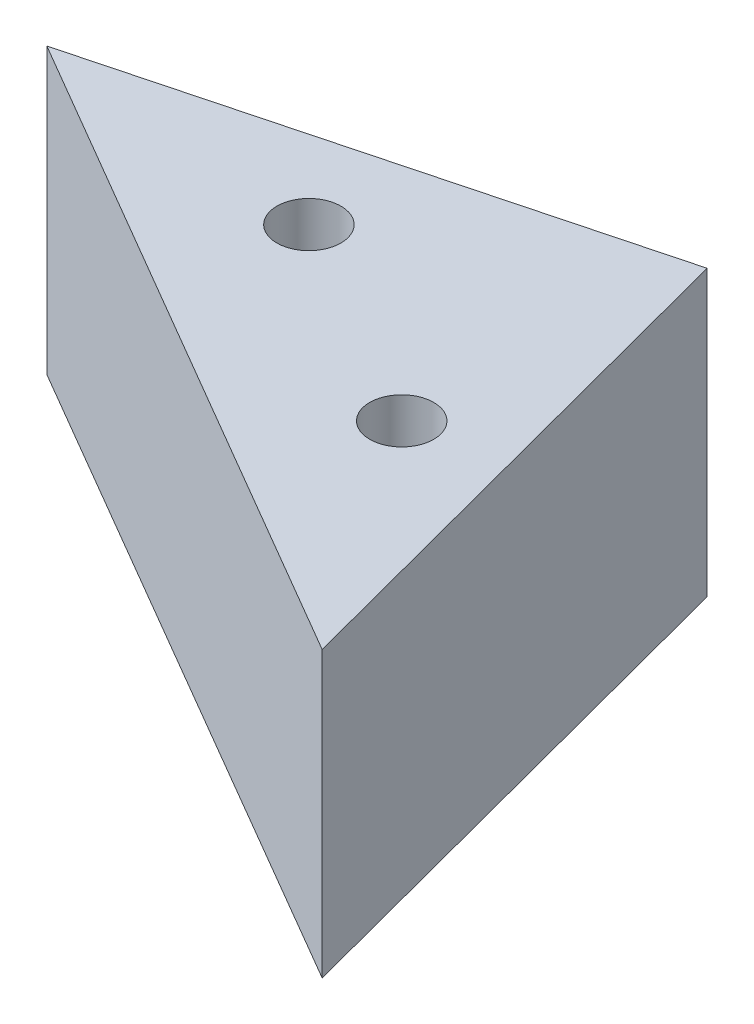
ISO-10303-21;
HEADER;
FILE_DESCRIPTION(('STEP AP214'),'2;1');
FILE_NAME('part.step','',(''),(''),'','','');
FILE_SCHEMA(('AUTOMOTIVE_DESIGN { 1 0 10303 214 1 1 1 1 }'));
ENDSEC;
DATA;
#1=APPLICATION_CONTEXT('core data for automotive mechanical design processes');
#2=APPLICATION_PROTOCOL_DEFINITION('international standard','automotive_design',2000,#1);
#3=PRODUCT_CONTEXT('',#1,'mechanical');
#4=PRODUCT('Part','Part','',(#3));
#5=PRODUCT_RELATED_PRODUCT_CATEGORY('part','',(#4));
#6=PRODUCT_DEFINITION_FORMATION('','',#4);
#7=PRODUCT_DEFINITION_CONTEXT('part definition',#1,'design');
#8=PRODUCT_DEFINITION('design','',#6,#7);
#9=PRODUCT_DEFINITION_SHAPE('','',#8);
#10=(LENGTH_UNIT() NAMED_UNIT(*) SI_UNIT(.MILLI.,.METRE.));
#11=(NAMED_UNIT(*) PLANE_ANGLE_UNIT() SI_UNIT($,.RADIAN.));
#12=(NAMED_UNIT(*) SI_UNIT($,.STERADIAN.) SOLID_ANGLE_UNIT());
#13=UNCERTAINTY_MEASURE_WITH_UNIT(LENGTH_MEASURE(1.E-05),#10,'distance_accuracy_value','');
#14=(GEOMETRIC_REPRESENTATION_CONTEXT(3) GLOBAL_UNCERTAINTY_ASSIGNED_CONTEXT((#13)) GLOBAL_UNIT_ASSIGNED_CONTEXT((#10,
#11,#12)) REPRESENTATION_CONTEXT('',''));
#15=CARTESIAN_POINT('',(0.,0.,0.));
#16=DIRECTION('',(0.,0.,1.));
#17=DIRECTION('',(1.,0.,0.));
#18=AXIS2_PLACEMENT_3D('',#15,#16,#17);
#19=CARTESIAN_POINT('',(0.,-20.,0.));
#20=DIRECTION('',(-0.254739163815733,0.,-0.967009802648588));
#21=DIRECTION('',(-0.967009802648588,0.,0.254739163815733));
#22=AXIS2_PLACEMENT_3D('',#19,#20,#21);
#23=PLANE('',#22);
#24=DIRECTION('',(-0.967009802648588,0.,0.254739163815733));
#25=VECTOR('',#24,1.);
#26=CARTESIAN_POINT('',(0.,0.,0.));
#27=LINE('',#26,#25);
#28=CARTESIAN_POINT('',(36.7463725006463,0.,-9.68008822499784));
#29=VERTEX_POINT('',#28);
#30=CARTESIAN_POINT('',(0.,0.,0.));
#31=VERTEX_POINT('',#30);
#32=EDGE_CURVE('E96',#29,#31,#27,.T.);
#33=ORIENTED_EDGE('',*,*,#32,.F.);
#34=DIRECTION('',(0.,1.,0.));
#35=VECTOR('',#34,1.);
#36=CARTESIAN_POINT('',(36.7463725006463,-20.,-9.68008822499784));
#37=LINE('',#36,#35);
#38=CARTESIAN_POINT('',(36.7463725006463,-20.,-9.68008822499784));
#39=VERTEX_POINT('',#38);
#40=EDGE_CURVE('E11',#39,#29,#37,.T.);
#41=ORIENTED_EDGE('',*,*,#40,.F.);
#42=DIRECTION('',(-0.967009802648588,0.,0.254739163815733));
#43=VECTOR('',#42,1.);
#44=CARTESIAN_POINT('',(0.,-20.,0.));
#45=LINE('',#44,#43);
#46=CARTESIAN_POINT('',(0.,-20.,0.));
#47=VERTEX_POINT('',#46);
#48=EDGE_CURVE('E84',#39,#47,#45,.T.);
#49=ORIENTED_EDGE('',*,*,#48,.T.);
#50=DIRECTION('',(0.,1.,0.));
#51=VECTOR('',#50,1.);
#52=CARTESIAN_POINT('',(0.,-20.,0.));
#53=LINE('',#52,#51);
#54=EDGE_CURVE('E42',#47,#31,#53,.T.);
#55=ORIENTED_EDGE('',*,*,#54,.T.);
#56=EDGE_LOOP('',(#33,#41,#49,#55));
#57=FACE_BOUND('',#56,.T.);
#58=ADVANCED_FACE('F41',(#57),#23,.T.);
#59=CARTESIAN_POINT('',(36.7463725006463,-20.,-9.68008822499784));
#60=DIRECTION('',(0.967010896395087,0.,-0.254735011832238));
#61=DIRECTION('',(-0.254735011832238,0.,-0.967010896395087));
#62=AXIS2_PLACEMENT_3D('',#59,#60,#61);
#63=PLANE('',#62);
#64=DIRECTION('',(-0.254735011832238,0.,-0.967010896395087));
#65=VECTOR('',#64,1.);
#66=CARTESIAN_POINT('',(36.7463725006463,0.,-9.68008822499784));
#67=LINE('',#66,#65);
#68=CARTESIAN_POINT('',(46.4263029502714,0.,27.0663258380155));
#69=VERTEX_POINT('',#68);
#70=EDGE_CURVE('E87',#69,#29,#67,.T.);
#71=ORIENTED_EDGE('',*,*,#70,.F.);
#72=DIRECTION('',(0.,1.,0.));
#73=VECTOR('',#72,1.);
#74=CARTESIAN_POINT('',(46.4263029502714,-20.,27.0663258380155));
#75=LINE('',#74,#73);
#76=CARTESIAN_POINT('',(46.4263029502714,-20.,27.0663258380155));
#77=VERTEX_POINT('',#76);
#78=EDGE_CURVE('E49',#77,#69,#75,.T.);
#79=ORIENTED_EDGE('',*,*,#78,.F.);
#80=DIRECTION('',(-0.254735011832238,0.,-0.967010896395087));
#81=VECTOR('',#80,1.);
#82=CARTESIAN_POINT('',(36.7463725006463,-20.,-9.68008822499784));
#83=LINE('',#82,#81);
#84=EDGE_CURVE('E85',#77,#39,#83,.T.);
#85=ORIENTED_EDGE('',*,*,#84,.T.);
#86=ORIENTED_EDGE('',*,*,#40,.T.);
#87=EDGE_LOOP('',(#71,#79,#85,#86));
#88=FACE_BOUND('',#87,.T.);
#89=ADVANCED_FACE('F101',(#88),#63,.T.);
#90=CARTESIAN_POINT('',(0.,-20.,0.));
#91=DIRECTION('',(-0.503653253405573,0.,0.863905897846509));
#92=DIRECTION('',(0.863905897846509,0.,0.503653253405573));
#93=AXIS2_PLACEMENT_3D('',#90,#91,#92);
#94=PLANE('',#93);
#95=DIRECTION('',(0.863905897846509,0.,0.503653253405572));
#96=VECTOR('',#95,1.);
#97=CARTESIAN_POINT('',(0.,0.,0.));
#98=LINE('',#97,#96);
#99=EDGE_CURVE('E77',#31,#69,#98,.T.);
#100=ORIENTED_EDGE('',*,*,#99,.F.);
#101=ORIENTED_EDGE('',*,*,#54,.F.);
#102=DIRECTION('',(0.863905897846509,0.,0.503653253405572));
#103=VECTOR('',#102,1.);
#104=CARTESIAN_POINT('',(0.,-20.,0.));
#105=LINE('',#104,#103);
#106=EDGE_CURVE('E76',#47,#77,#105,.T.);
#107=ORIENTED_EDGE('',*,*,#106,.T.);
#108=ORIENTED_EDGE('',*,*,#78,.T.);
#109=EDGE_LOOP('',(#100,#101,#107,#108));
#110=FACE_BOUND('',#109,.T.);
#111=ADVANCED_FACE('F80',(#110),#94,.T.);
#112=CARTESIAN_POINT('',(0.,-20.,0.));
#113=DIRECTION('',(0.,-1.,0.));
#114=DIRECTION('',(0.,0.,-1.));
#115=AXIS2_PLACEMENT_3D('',#112,#113,#114);
#116=PLANE('',#115);
#117=ORIENTED_EDGE('',*,*,#48,.F.);
#118=ORIENTED_EDGE('',*,*,#84,.F.);
#119=ORIENTED_EDGE('',*,*,#106,.F.);
#120=EDGE_LOOP('',(#117,#118,#119));
#121=FACE_BOUND('',#120,.T.);
#122=ADVANCED_FACE('F83',(#121),#116,.T.);
#123=CARTESIAN_POINT('',(0.,0.,0.));
#124=DIRECTION('',(0.,-1.,0.));
#125=DIRECTION('',(0.,0.,-1.));
#126=AXIS2_PLACEMENT_3D('',#123,#124,#125);
#127=PLANE('',#126);
#128=CARTESIAN_POINT('',(35.3007668988908,0.,10.3488963834184));
#129=DIRECTION('',(0.,1.,0.));
#130=DIRECTION('',(0.,0.,1.));
#131=AXIS2_PLACEMENT_3D('',#128,#129,#130);
#132=CIRCLE('',#131,2.25);
#133=CARTESIAN_POINT('',(35.3007668988908,0.,12.5988963834184));
#134=VERTEX_POINT('',#133);
#135=EDGE_CURVE('E131',#134,#134,#132,.T.);
#136=ORIENTED_EDGE('',*,*,#135,.F.);
#137=EDGE_LOOP('',(#136));
#138=FACE_BOUND('',#137,.T.);
#139=CARTESIAN_POINT('',(20.0854797144298,0.,1.65995588750108));
#140=DIRECTION('',(0.,1.,0.));
#141=DIRECTION('',(0.,0.,1.));
#142=AXIS2_PLACEMENT_3D('',#139,#140,#141);
#143=CIRCLE('',#142,2.25);
#144=CARTESIAN_POINT('',(20.0854797144298,0.,3.90995588750107));
#145=VERTEX_POINT('',#144);
#146=EDGE_CURVE('E136',#145,#145,#143,.T.);
#147=ORIENTED_EDGE('',*,*,#146,.F.);
#148=EDGE_LOOP('',(#147));
#149=FACE_BOUND('',#148,.T.);
#150=ORIENTED_EDGE('',*,*,#32,.T.);
#151=ORIENTED_EDGE('',*,*,#99,.T.);
#152=ORIENTED_EDGE('',*,*,#70,.T.);
#153=EDGE_LOOP('',(#150,#151,#152));
#154=FACE_BOUND('',#153,.T.);
#155=ADVANCED_FACE('F99',(#138,#149,#154),#127,.F.);
#156=CARTESIAN_POINT('',(20.0854797144298,-5.,1.65995588750108));
#157=DIRECTION('',(0.,1.,0.));
#158=DIRECTION('',(0.,0.,1.));
#159=AXIS2_PLACEMENT_3D('',#156,#157,#158);
#160=CYLINDRICAL_SURFACE('',#159,2.25);
#161=CARTESIAN_POINT('',(20.0854797144298,-5.,1.65995588750108));
#162=DIRECTION('',(0.,1.,0.));
#163=DIRECTION('',(0.,0.,1.));
#164=AXIS2_PLACEMENT_3D('',#161,#162,#163);
#165=CIRCLE('',#164,2.25);
#166=CARTESIAN_POINT('',(20.0854797144298,-5.,3.90995588750107));
#167=VERTEX_POINT('',#166);
#168=EDGE_CURVE('E95',#167,#167,#165,.T.);
#169=ORIENTED_EDGE('',*,*,#168,.F.);
#170=EDGE_LOOP('',(#169));
#171=FACE_BOUND('',#170,.T.);
#172=ORIENTED_EDGE('',*,*,#146,.T.);
#173=EDGE_LOOP('',(#172));
#174=FACE_BOUND('',#173,.T.);
#175=ADVANCED_FACE('F112',(#171,#174),#160,.F.);
#176=CARTESIAN_POINT('',(20.0854797144298,-5.,1.65995588750108));
#177=DIRECTION('',(0.,1.,0.));
#178=DIRECTION('',(0.,0.,1.));
#179=AXIS2_PLACEMENT_3D('',#176,#177,#178);
#180=PLANE('',#179);
#181=ORIENTED_EDGE('',*,*,#168,.T.);
#182=EDGE_LOOP('',(#181));
#183=FACE_BOUND('',#182,.T.);
#184=ADVANCED_FACE('F113',(#183),#180,.T.);
#185=CARTESIAN_POINT('',(35.3007668988908,-5.,10.3488963834184));
#186=DIRECTION('',(0.,1.,0.));
#187=DIRECTION('',(0.,0.,1.));
#188=AXIS2_PLACEMENT_3D('',#185,#186,#187);
#189=CYLINDRICAL_SURFACE('',#188,2.25);
#190=CARTESIAN_POINT('',(35.3007668988908,-5.,10.3488963834184));
#191=DIRECTION('',(0.,1.,0.));
#192=DIRECTION('',(0.,0.,1.));
#193=AXIS2_PLACEMENT_3D('',#190,#191,#192);
#194=CIRCLE('',#193,2.25);
#195=CARTESIAN_POINT('',(35.3007668988908,-5.,12.5988963834184));
#196=VERTEX_POINT('',#195);
#197=EDGE_CURVE('E98',#196,#196,#194,.T.);
#198=ORIENTED_EDGE('',*,*,#197,.F.);
#199=EDGE_LOOP('',(#198));
#200=FACE_BOUND('',#199,.T.);
#201=ORIENTED_EDGE('',*,*,#135,.T.);
#202=EDGE_LOOP('',(#201));
#203=FACE_BOUND('',#202,.T.);
#204=ADVANCED_FACE('F116',(#200,#203),#189,.F.);
#205=CARTESIAN_POINT('',(0.,-5.,0.));
#206=DIRECTION('',(0.,1.,0.));
#207=DIRECTION('',(0.,0.,1.));
#208=AXIS2_PLACEMENT_3D('',#205,#206,#207);
#209=PLANE('',#208);
#210=ORIENTED_EDGE('',*,*,#197,.T.);
#211=EDGE_LOOP('',(#210));
#212=FACE_BOUND('',#211,.T.);
#213=ADVANCED_FACE('F124',(#212),#209,.T.);
#214=CLOSED_SHELL('',(#58,#89,#111,#122,#155,#175,#184,#204,#213));
#215=MANIFOLD_SOLID_BREP('B2',#214);
#216=ADVANCED_BREP_SHAPE_REPRESENTATION('',(#18,#215),#14);
#217=SHAPE_DEFINITION_REPRESENTATION(#9,#216);
ENDSEC;
END-ISO-10303-21;
